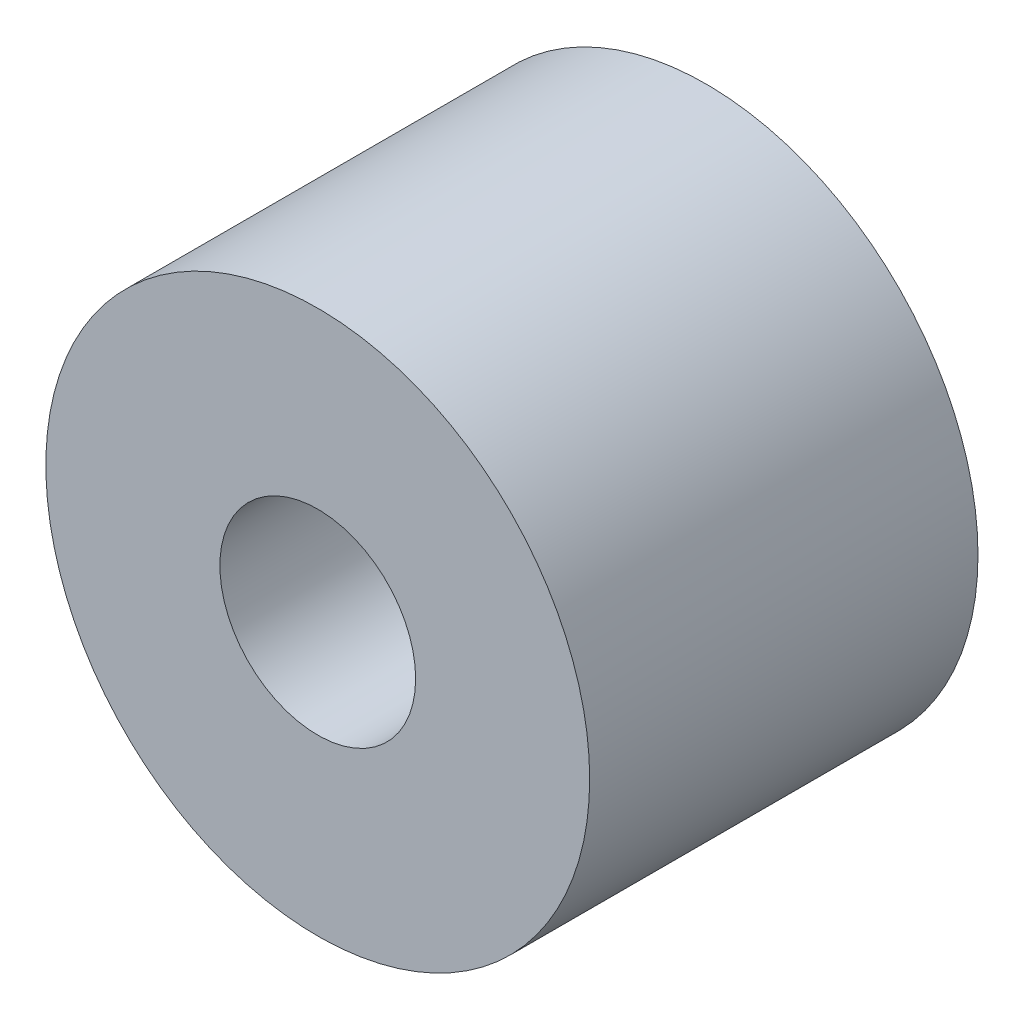
ISO-10303-21;
HEADER;
FILE_DESCRIPTION(('STEP AP214'),'2;1');
FILE_NAME('part.step','',(''),(''),'','','');
FILE_SCHEMA(('AUTOMOTIVE_DESIGN { 1 0 10303 214 1 1 1 1 }'));
ENDSEC;
DATA;
#1=APPLICATION_CONTEXT('core data for automotive mechanical design processes');
#2=APPLICATION_PROTOCOL_DEFINITION('international standard','automotive_design',2000,#1);
#3=PRODUCT_CONTEXT('',#1,'mechanical');
#4=PRODUCT('Part','Part','',(#3));
#5=PRODUCT_RELATED_PRODUCT_CATEGORY('part','',(#4));
#6=PRODUCT_DEFINITION_FORMATION('','',#4);
#7=PRODUCT_DEFINITION_CONTEXT('part definition',#1,'design');
#8=PRODUCT_DEFINITION('design','',#6,#7);
#9=PRODUCT_DEFINITION_SHAPE('','',#8);
#10=(LENGTH_UNIT() NAMED_UNIT(*) SI_UNIT(.MILLI.,.METRE.));
#11=(NAMED_UNIT(*) PLANE_ANGLE_UNIT() SI_UNIT($,.RADIAN.));
#12=(NAMED_UNIT(*) SI_UNIT($,.STERADIAN.) SOLID_ANGLE_UNIT());
#13=UNCERTAINTY_MEASURE_WITH_UNIT(LENGTH_MEASURE(1.E-05),#10,'distance_accuracy_value','');
#14=(GEOMETRIC_REPRESENTATION_CONTEXT(3) GLOBAL_UNCERTAINTY_ASSIGNED_CONTEXT((#13)) GLOBAL_UNIT_ASSIGNED_CONTEXT((#10,
#11,#12)) REPRESENTATION_CONTEXT('',''));
#15=CARTESIAN_POINT('',(0.,0.,0.));
#16=DIRECTION('',(0.,0.,1.));
#17=DIRECTION('',(1.,0.,0.));
#18=AXIS2_PLACEMENT_3D('',#15,#16,#17);
#19=CARTESIAN_POINT('',(0.,0.,9.0678));
#20=DIRECTION('',(0.,0.,1.));
#21=DIRECTION('',(1.,0.,0.));
#22=AXIS2_PLACEMENT_3D('',#19,#20,#21);
#23=PLANE('',#22);
#24=CARTESIAN_POINT('',(0.,0.,9.0678));
#25=DIRECTION('',(0.,0.,1.));
#26=DIRECTION('',(1.,0.,0.));
#27=AXIS2_PLACEMENT_3D('',#24,#25,#26);
#28=CIRCLE('',#27,6.35);
#29=CARTESIAN_POINT('',(6.35,0.,9.0678));
#30=VERTEX_POINT('',#29);
#31=EDGE_CURVE('E10',#30,#30,#28,.T.);
#32=ORIENTED_EDGE('',*,*,#31,.T.);
#33=EDGE_LOOP('',(#32));
#34=FACE_BOUND('',#33,.T.);
#35=CARTESIAN_POINT('',(0.,0.,9.0678));
#36=DIRECTION('',(0.,0.,1.));
#37=DIRECTION('',(1.,0.,0.));
#38=AXIS2_PLACEMENT_3D('',#35,#36,#37);
#39=CIRCLE('',#38,2.286);
#40=CARTESIAN_POINT('',(2.286,0.,9.0678));
#41=VERTEX_POINT('',#40);
#42=EDGE_CURVE('E48',#41,#41,#39,.T.);
#43=ORIENTED_EDGE('',*,*,#42,.F.);
#44=EDGE_LOOP('',(#43));
#45=FACE_BOUND('',#44,.T.);
#46=ADVANCED_FACE('F37',(#34,#45),#23,.T.);
#47=CARTESIAN_POINT('',(0.,0.,0.));
#48=DIRECTION('',(0.,0.,1.));
#49=DIRECTION('',(1.,0.,0.));
#50=AXIS2_PLACEMENT_3D('',#47,#48,#49);
#51=PLANE('',#50);
#52=CARTESIAN_POINT('',(0.,0.,0.));
#53=DIRECTION('',(0.,0.,1.));
#54=DIRECTION('',(1.,0.,0.));
#55=AXIS2_PLACEMENT_3D('',#52,#53,#54);
#56=CIRCLE('',#55,6.35);
#57=CARTESIAN_POINT('',(6.35,0.,0.));
#58=VERTEX_POINT('',#57);
#59=EDGE_CURVE('E41',#58,#58,#56,.T.);
#60=ORIENTED_EDGE('',*,*,#59,.F.);
#61=EDGE_LOOP('',(#60));
#62=FACE_BOUND('',#61,.T.);
#63=CARTESIAN_POINT('',(0.,0.,0.));
#64=DIRECTION('',(0.,0.,1.));
#65=DIRECTION('',(1.,0.,0.));
#66=AXIS2_PLACEMENT_3D('',#63,#64,#65);
#67=CIRCLE('',#66,2.286);
#68=CARTESIAN_POINT('',(2.286,0.,0.));
#69=VERTEX_POINT('',#68);
#70=EDGE_CURVE('E50',#69,#69,#67,.T.);
#71=ORIENTED_EDGE('',*,*,#70,.T.);
#72=EDGE_LOOP('',(#71));
#73=FACE_BOUND('',#72,.T.);
#74=ADVANCED_FACE('F60',(#62,#73),#51,.F.);
#75=CARTESIAN_POINT('',(0.,0.,9.0678));
#76=DIRECTION('',(0.,0.,-1.));
#77=DIRECTION('',(-1.,0.,0.));
#78=AXIS2_PLACEMENT_3D('',#75,#76,#77);
#79=CYLINDRICAL_SURFACE('',#78,6.35);
#80=ORIENTED_EDGE('',*,*,#31,.F.);
#81=EDGE_LOOP('',(#80));
#82=FACE_BOUND('',#81,.T.);
#83=ORIENTED_EDGE('',*,*,#59,.T.);
#84=EDGE_LOOP('',(#83));
#85=FACE_BOUND('',#84,.T.);
#86=ADVANCED_FACE('F39',(#82,#85),#79,.T.);
#87=CARTESIAN_POINT('',(0.,0.,9.0678));
#88=DIRECTION('',(0.,0.,-1.));
#89=DIRECTION('',(-1.,0.,0.));
#90=AXIS2_PLACEMENT_3D('',#87,#88,#89);
#91=CYLINDRICAL_SURFACE('',#90,2.286);
#92=ORIENTED_EDGE('',*,*,#42,.T.);
#93=EDGE_LOOP('',(#92));
#94=FACE_BOUND('',#93,.T.);
#95=ORIENTED_EDGE('',*,*,#70,.F.);
#96=EDGE_LOOP('',(#95));
#97=FACE_BOUND('',#96,.T.);
#98=ADVANCED_FACE('F56',(#94,#97),#91,.F.);
#99=CLOSED_SHELL('',(#46,#74,#86,#98));
#100=MANIFOLD_SOLID_BREP('B2',#99);
#101=ADVANCED_BREP_SHAPE_REPRESENTATION('',(#18,#100),#14);
#102=SHAPE_DEFINITION_REPRESENTATION(#9,#101);
ENDSEC;
END-ISO-10303-21;
